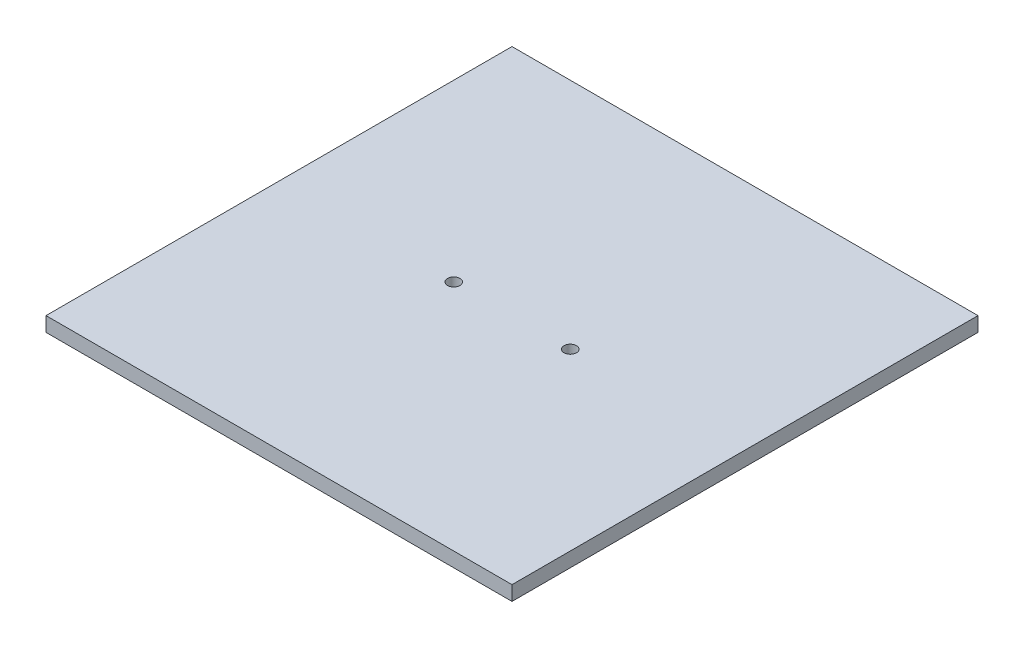
ISO-10303-21;
HEADER;
FILE_DESCRIPTION(('STEP AP214'),'2;1');
FILE_NAME('part.step','',(''),(''),'','','');
FILE_SCHEMA(('AUTOMOTIVE_DESIGN { 1 0 10303 214 1 1 1 1 }'));
ENDSEC;
DATA;
#1=APPLICATION_CONTEXT('core data for automotive mechanical design processes');
#2=APPLICATION_PROTOCOL_DEFINITION('international standard','automotive_design',2000,#1);
#3=PRODUCT_CONTEXT('',#1,'mechanical');
#4=PRODUCT('Part','Part','',(#3));
#5=PRODUCT_RELATED_PRODUCT_CATEGORY('part','',(#4));
#6=PRODUCT_DEFINITION_FORMATION('','',#4);
#7=PRODUCT_DEFINITION_CONTEXT('part definition',#1,'design');
#8=PRODUCT_DEFINITION('design','',#6,#7);
#9=PRODUCT_DEFINITION_SHAPE('','',#8);
#10=(LENGTH_UNIT() NAMED_UNIT(*) SI_UNIT(.MILLI.,.METRE.));
#11=(NAMED_UNIT(*) PLANE_ANGLE_UNIT() SI_UNIT($,.RADIAN.));
#12=(NAMED_UNIT(*) SI_UNIT($,.STERADIAN.) SOLID_ANGLE_UNIT());
#13=UNCERTAINTY_MEASURE_WITH_UNIT(LENGTH_MEASURE(1.E-05),#10,'distance_accuracy_value','');
#14=(GEOMETRIC_REPRESENTATION_CONTEXT(3) GLOBAL_UNCERTAINTY_ASSIGNED_CONTEXT((#13)) GLOBAL_UNIT_ASSIGNED_CONTEXT((#10,
#11,#12)) REPRESENTATION_CONTEXT('',''));
#15=CARTESIAN_POINT('',(0.,0.,0.));
#16=DIRECTION('',(0.,0.,1.));
#17=DIRECTION('',(1.,0.,0.));
#18=AXIS2_PLACEMENT_3D('',#15,#16,#17);
#19=CARTESIAN_POINT('',(50.8,3.175,50.8));
#20=DIRECTION('',(-1.,0.,0.));
#21=DIRECTION('',(0.,0.,1.));
#22=AXIS2_PLACEMENT_3D('',#19,#20,#21);
#23=PLANE('',#22);
#24=DIRECTION('',(0.,0.,-1.));
#25=VECTOR('',#24,1.);
#26=CARTESIAN_POINT('',(50.8,0.,50.8));
#27=LINE('',#26,#25);
#28=CARTESIAN_POINT('',(50.8,0.,50.8));
#29=VERTEX_POINT('',#28);
#30=CARTESIAN_POINT('',(50.8,0.,-50.8));
#31=VERTEX_POINT('',#30);
#32=EDGE_CURVE('E102',#29,#31,#27,.T.);
#33=ORIENTED_EDGE('',*,*,#32,.T.);
#34=DIRECTION('',(0.,-1.,0.));
#35=VECTOR('',#34,1.);
#36=CARTESIAN_POINT('',(50.8,3.175,-50.8));
#37=LINE('',#36,#35);
#38=CARTESIAN_POINT('',(50.8,3.175,-50.8));
#39=VERTEX_POINT('',#38);
#40=EDGE_CURVE('E11',#39,#31,#37,.T.);
#41=ORIENTED_EDGE('',*,*,#40,.F.);
#42=DIRECTION('',(0.,0.,-1.));
#43=VECTOR('',#42,1.);
#44=CARTESIAN_POINT('',(50.8,3.175,50.8));
#45=LINE('',#44,#43);
#46=CARTESIAN_POINT('',(50.8,3.175,50.8));
#47=VERTEX_POINT('',#46);
#48=EDGE_CURVE('E90',#47,#39,#45,.T.);
#49=ORIENTED_EDGE('',*,*,#48,.F.);
#50=DIRECTION('',(0.,-1.,0.));
#51=VECTOR('',#50,1.);
#52=CARTESIAN_POINT('',(50.8,3.175,50.8));
#53=LINE('',#52,#51);
#54=EDGE_CURVE('E98',#47,#29,#53,.T.);
#55=ORIENTED_EDGE('',*,*,#54,.T.);
#56=EDGE_LOOP('',(#33,#41,#49,#55));
#57=FACE_BOUND('',#56,.T.);
#58=ADVANCED_FACE('F39',(#57),#23,.F.);
#59=CARTESIAN_POINT('',(-50.8,3.175,-50.8));
#60=DIRECTION('',(0.,0.,1.));
#61=DIRECTION('',(1.,0.,0.));
#62=AXIS2_PLACEMENT_3D('',#59,#60,#61);
#63=PLANE('',#62);
#64=DIRECTION('',(-1.,0.,0.));
#65=VECTOR('',#64,1.);
#66=CARTESIAN_POINT('',(-50.8,0.,-50.8));
#67=LINE('',#66,#65);
#68=CARTESIAN_POINT('',(-50.8,0.,-50.8));
#69=VERTEX_POINT('',#68);
#70=EDGE_CURVE('E94',#31,#69,#67,.T.);
#71=ORIENTED_EDGE('',*,*,#70,.T.);
#72=DIRECTION('',(0.,-1.,0.));
#73=VECTOR('',#72,1.);
#74=CARTESIAN_POINT('',(-50.8,3.175,-50.8));
#75=LINE('',#74,#73);
#76=CARTESIAN_POINT('',(-50.8,3.175,-50.8));
#77=VERTEX_POINT('',#76);
#78=EDGE_CURVE('E47',#77,#69,#75,.T.);
#79=ORIENTED_EDGE('',*,*,#78,.F.);
#80=DIRECTION('',(-1.,0.,0.));
#81=VECTOR('',#80,1.);
#82=CARTESIAN_POINT('',(-50.8,3.175,-50.8));
#83=LINE('',#82,#81);
#84=EDGE_CURVE('E85',#39,#77,#83,.T.);
#85=ORIENTED_EDGE('',*,*,#84,.F.);
#86=ORIENTED_EDGE('',*,*,#40,.T.);
#87=EDGE_LOOP('',(#71,#79,#85,#86));
#88=FACE_BOUND('',#87,.T.);
#89=ADVANCED_FACE('F93',(#88),#63,.F.);
#90=CARTESIAN_POINT('',(-50.8,3.175,50.8));
#91=DIRECTION('',(1.,0.,0.));
#92=DIRECTION('',(0.,0.,-1.));
#93=AXIS2_PLACEMENT_3D('',#90,#91,#92);
#94=PLANE('',#93);
#95=DIRECTION('',(0.,0.,1.));
#96=VECTOR('',#95,1.);
#97=CARTESIAN_POINT('',(-50.8,0.,50.8));
#98=LINE('',#97,#96);
#99=CARTESIAN_POINT('',(-50.8,0.,50.8));
#100=VERTEX_POINT('',#99);
#101=EDGE_CURVE('E72',#69,#100,#98,.T.);
#102=ORIENTED_EDGE('',*,*,#101,.T.);
#103=DIRECTION('',(0.,-1.,0.));
#104=VECTOR('',#103,1.);
#105=CARTESIAN_POINT('',(-50.8,3.175,50.8));
#106=LINE('',#105,#104);
#107=CARTESIAN_POINT('',(-50.8,3.175,50.8));
#108=VERTEX_POINT('',#107);
#109=EDGE_CURVE('E95',#108,#100,#106,.T.);
#110=ORIENTED_EDGE('',*,*,#109,.F.);
#111=DIRECTION('',(0.,0.,1.));
#112=VECTOR('',#111,1.);
#113=CARTESIAN_POINT('',(-50.8,3.175,50.8));
#114=LINE('',#113,#112);
#115=EDGE_CURVE('E88',#77,#108,#114,.T.);
#116=ORIENTED_EDGE('',*,*,#115,.F.);
#117=ORIENTED_EDGE('',*,*,#78,.T.);
#118=EDGE_LOOP('',(#102,#110,#116,#117));
#119=FACE_BOUND('',#118,.T.);
#120=ADVANCED_FACE('F96',(#119),#94,.F.);
#121=CARTESIAN_POINT('',(-50.8,3.175,50.8));
#122=DIRECTION('',(0.,0.,-1.));
#123=DIRECTION('',(-1.,0.,0.));
#124=AXIS2_PLACEMENT_3D('',#121,#122,#123);
#125=PLANE('',#124);
#126=DIRECTION('',(1.,0.,0.));
#127=VECTOR('',#126,1.);
#128=CARTESIAN_POINT('',(-50.8,0.,50.8));
#129=LINE('',#128,#127);
#130=EDGE_CURVE('E78',#100,#29,#129,.T.);
#131=ORIENTED_EDGE('',*,*,#130,.T.);
#132=ORIENTED_EDGE('',*,*,#54,.F.);
#133=DIRECTION('',(1.,0.,0.));
#134=VECTOR('',#133,1.);
#135=CARTESIAN_POINT('',(-50.8,3.175,50.8));
#136=LINE('',#135,#134);
#137=EDGE_CURVE('E55',#108,#47,#136,.T.);
#138=ORIENTED_EDGE('',*,*,#137,.F.);
#139=ORIENTED_EDGE('',*,*,#109,.T.);
#140=EDGE_LOOP('',(#131,#132,#138,#139));
#141=FACE_BOUND('',#140,.T.);
#142=ADVANCED_FACE('F110',(#141),#125,.F.);
#143=CARTESIAN_POINT('',(0.,3.175,0.));
#144=DIRECTION('',(0.,-1.,0.));
#145=DIRECTION('',(0.,0.,-1.));
#146=AXIS2_PLACEMENT_3D('',#143,#144,#145);
#147=PLANE('',#146);
#148=CARTESIAN_POINT('',(-12.7,3.175,0.));
#149=DIRECTION('',(0.,1.,0.));
#150=DIRECTION('',(0.,0.,1.));
#151=AXIS2_PLACEMENT_3D('',#148,#149,#150);
#152=CIRCLE('',#151,1.35255);
#153=CARTESIAN_POINT('',(-12.7,3.175,1.35255));
#154=VERTEX_POINT('',#153);
#155=EDGE_CURVE('E124',#154,#154,#152,.T.);
#156=ORIENTED_EDGE('',*,*,#155,.F.);
#157=EDGE_LOOP('',(#156));
#158=FACE_BOUND('',#157,.T.);
#159=CARTESIAN_POINT('',(12.7,3.175,0.));
#160=DIRECTION('',(0.,1.,0.));
#161=DIRECTION('',(0.,0.,1.));
#162=AXIS2_PLACEMENT_3D('',#159,#160,#161);
#163=CIRCLE('',#162,1.35255);
#164=CARTESIAN_POINT('',(12.7,3.175,1.35254999999999));
#165=VERTEX_POINT('',#164);
#166=EDGE_CURVE('E118',#165,#165,#163,.T.);
#167=ORIENTED_EDGE('',*,*,#166,.F.);
#168=EDGE_LOOP('',(#167));
#169=FACE_BOUND('',#168,.T.);
#170=ORIENTED_EDGE('',*,*,#48,.T.);
#171=ORIENTED_EDGE('',*,*,#84,.T.);
#172=ORIENTED_EDGE('',*,*,#115,.T.);
#173=ORIENTED_EDGE('',*,*,#137,.T.);
#174=EDGE_LOOP('',(#170,#171,#172,#173));
#175=FACE_BOUND('',#174,.T.);
#176=ADVANCED_FACE('F86',(#158,#169,#175),#147,.F.);
#177=CARTESIAN_POINT('',(0.,0.,0.));
#178=DIRECTION('',(0.,-1.,0.));
#179=DIRECTION('',(0.,0.,-1.));
#180=AXIS2_PLACEMENT_3D('',#177,#178,#179);
#181=PLANE('',#180);
#182=CARTESIAN_POINT('',(-12.7,0.,0.));
#183=DIRECTION('',(0.,1.,0.));
#184=DIRECTION('',(0.,0.,1.));
#185=AXIS2_PLACEMENT_3D('',#182,#183,#184);
#186=CIRCLE('',#185,1.35255);
#187=CARTESIAN_POINT('',(-12.7,0.,1.35255));
#188=VERTEX_POINT('',#187);
#189=EDGE_CURVE('E121',#188,#188,#186,.T.);
#190=ORIENTED_EDGE('',*,*,#189,.T.);
#191=EDGE_LOOP('',(#190));
#192=FACE_BOUND('',#191,.T.);
#193=CARTESIAN_POINT('',(12.7,0.,0.));
#194=DIRECTION('',(0.,1.,0.));
#195=DIRECTION('',(0.,0.,1.));
#196=AXIS2_PLACEMENT_3D('',#193,#194,#195);
#197=CIRCLE('',#196,1.35255);
#198=CARTESIAN_POINT('',(12.7,0.,1.35254999999999));
#199=VERTEX_POINT('',#198);
#200=EDGE_CURVE('E105',#199,#199,#197,.T.);
#201=ORIENTED_EDGE('',*,*,#200,.T.);
#202=EDGE_LOOP('',(#201));
#203=FACE_BOUND('',#202,.T.);
#204=ORIENTED_EDGE('',*,*,#32,.F.);
#205=ORIENTED_EDGE('',*,*,#130,.F.);
#206=ORIENTED_EDGE('',*,*,#101,.F.);
#207=ORIENTED_EDGE('',*,*,#70,.F.);
#208=EDGE_LOOP('',(#204,#205,#206,#207));
#209=FACE_BOUND('',#208,.T.);
#210=ADVANCED_FACE('F113',(#192,#203,#209),#181,.T.);
#211=CARTESIAN_POINT('',(12.7,3.175,0.));
#212=DIRECTION('',(0.,1.,0.));
#213=DIRECTION('',(0.,0.,1.));
#214=AXIS2_PLACEMENT_3D('',#211,#212,#213);
#215=CYLINDRICAL_SURFACE('',#214,1.35255);
#216=ORIENTED_EDGE('',*,*,#200,.F.);
#217=EDGE_LOOP('',(#216));
#218=FACE_BOUND('',#217,.T.);
#219=ORIENTED_EDGE('',*,*,#166,.T.);
#220=EDGE_LOOP('',(#219));
#221=FACE_BOUND('',#220,.T.);
#222=ADVANCED_FACE('F135',(#218,#221),#215,.F.);
#223=CARTESIAN_POINT('',(-12.7,3.175,0.));
#224=DIRECTION('',(0.,1.,0.));
#225=DIRECTION('',(0.,0.,1.));
#226=AXIS2_PLACEMENT_3D('',#223,#224,#225);
#227=CYLINDRICAL_SURFACE('',#226,1.35255);
#228=ORIENTED_EDGE('',*,*,#189,.F.);
#229=EDGE_LOOP('',(#228));
#230=FACE_BOUND('',#229,.T.);
#231=ORIENTED_EDGE('',*,*,#155,.T.);
#232=EDGE_LOOP('',(#231));
#233=FACE_BOUND('',#232,.T.);
#234=ADVANCED_FACE('F128',(#230,#233),#227,.F.);
#235=CLOSED_SHELL('',(#58,#89,#120,#142,#176,#210,#222,#234));
#236=MANIFOLD_SOLID_BREP('B2',#235);
#237=ADVANCED_BREP_SHAPE_REPRESENTATION('',(#18,#236),#14);
#238=SHAPE_DEFINITION_REPRESENTATION(#9,#237);
ENDSEC;
END-ISO-10303-21;
